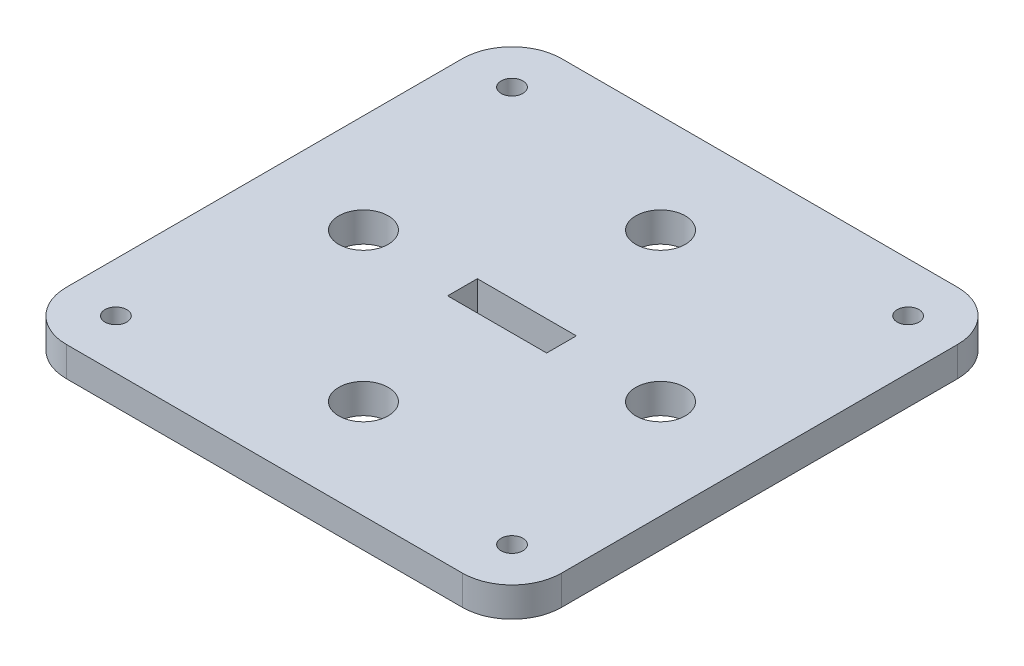
ISO-10303-21;
HEADER;
FILE_DESCRIPTION(('STEP AP214'),'2;1');
FILE_NAME('part.step','',(''),(''),'','','');
FILE_SCHEMA(('AUTOMOTIVE_DESIGN { 1 0 10303 214 1 1 1 1 }'));
ENDSEC;
DATA;
#1=APPLICATION_CONTEXT('core data for automotive mechanical design processes');
#2=APPLICATION_PROTOCOL_DEFINITION('international standard','automotive_design',2000,#1);
#3=PRODUCT_CONTEXT('',#1,'mechanical');
#4=PRODUCT('Part','Part','',(#3));
#5=PRODUCT_RELATED_PRODUCT_CATEGORY('part','',(#4));
#6=PRODUCT_DEFINITION_FORMATION('','',#4);
#7=PRODUCT_DEFINITION_CONTEXT('part definition',#1,'design');
#8=PRODUCT_DEFINITION('design','',#6,#7);
#9=PRODUCT_DEFINITION_SHAPE('','',#8);
#10=(LENGTH_UNIT() NAMED_UNIT(*) SI_UNIT(.MILLI.,.METRE.));
#11=(NAMED_UNIT(*) PLANE_ANGLE_UNIT() SI_UNIT($,.RADIAN.));
#12=(NAMED_UNIT(*) SI_UNIT($,.STERADIAN.) SOLID_ANGLE_UNIT());
#13=UNCERTAINTY_MEASURE_WITH_UNIT(LENGTH_MEASURE(1.E-05),#10,'distance_accuracy_value','');
#14=(GEOMETRIC_REPRESENTATION_CONTEXT(3) GLOBAL_UNCERTAINTY_ASSIGNED_CONTEXT((#13)) GLOBAL_UNIT_ASSIGNED_CONTEXT((#10,
#11,#12)) REPRESENTATION_CONTEXT('',''));
#15=CARTESIAN_POINT('',(0.,0.,0.));
#16=DIRECTION('',(0.,0.,1.));
#17=DIRECTION('',(1.,0.,0.));
#18=AXIS2_PLACEMENT_3D('',#15,#16,#17);
#19=CARTESIAN_POINT('',(0.,3.,0.));
#20=DIRECTION('',(0.,-1.,0.));
#21=DIRECTION('',(0.,0.,-1.));
#22=AXIS2_PLACEMENT_3D('',#19,#20,#21);
#23=PLANE('',#22);
#24=CARTESIAN_POINT('',(15.,3.,0.));
#25=DIRECTION('',(0.,1.,0.));
#26=DIRECTION('',(0.,0.,-1.));
#27=AXIS2_PLACEMENT_3D('',#24,#25,#26);
#28=CIRCLE('',#27,2.5);
#29=CARTESIAN_POINT('',(15.,3.,-2.5));
#30=VERTEX_POINT('',#29);
#31=EDGE_CURVE('E168',#30,#30,#28,.T.);
#32=ORIENTED_EDGE('',*,*,#31,.F.);
#33=EDGE_LOOP('',(#32));
#34=FACE_BOUND('',#33,.T.);
#35=CARTESIAN_POINT('',(-15.,3.,0.));
#36=DIRECTION('',(0.,1.,0.));
#37=DIRECTION('',(0.,0.,1.));
#38=AXIS2_PLACEMENT_3D('',#35,#36,#37);
#39=CIRCLE('',#38,2.5);
#40=CARTESIAN_POINT('',(-15.,3.,2.5));
#41=VERTEX_POINT('',#40);
#42=EDGE_CURVE('E174',#41,#41,#39,.T.);
#43=ORIENTED_EDGE('',*,*,#42,.F.);
#44=EDGE_LOOP('',(#43));
#45=FACE_BOUND('',#44,.T.);
#46=DIRECTION('',(0.,0.,-1.));
#47=VECTOR('',#46,1.);
#48=CARTESIAN_POINT('',(25.,3.,25.));
#49=LINE('',#48,#47);
#50=CARTESIAN_POINT('',(25.,3.,20.));
#51=VERTEX_POINT('',#50);
#52=CARTESIAN_POINT('',(25.,3.,-20.));
#53=VERTEX_POINT('',#52);
#54=EDGE_CURVE('E180',#51,#53,#49,.T.);
#55=ORIENTED_EDGE('',*,*,#54,.T.);
#56=CARTESIAN_POINT('',(20.,3.,-20.));
#57=DIRECTION('',(0.,-1.,0.));
#58=DIRECTION('',(0.,0.,-1.));
#59=AXIS2_PLACEMENT_3D('',#56,#57,#58);
#60=CIRCLE('',#59,5.);
#61=CARTESIAN_POINT('',(20.,3.,-25.));
#62=VERTEX_POINT('',#61);
#63=EDGE_CURVE('E223',#53,#62,#60,.F.);
#64=ORIENTED_EDGE('',*,*,#63,.T.);
#65=DIRECTION('',(-1.,0.,0.));
#66=VECTOR('',#65,1.);
#67=CARTESIAN_POINT('',(-25.,3.,-25.));
#68=LINE('',#67,#66);
#69=CARTESIAN_POINT('',(-20.,3.,-25.));
#70=VERTEX_POINT('',#69);
#71=EDGE_CURVE('E183',#62,#70,#68,.T.);
#72=ORIENTED_EDGE('',*,*,#71,.T.);
#73=CARTESIAN_POINT('',(-20.,3.,-20.));
#74=DIRECTION('',(0.,-1.,0.));
#75=DIRECTION('',(0.,0.,-1.));
#76=AXIS2_PLACEMENT_3D('',#73,#74,#75);
#77=CIRCLE('',#76,5.);
#78=CARTESIAN_POINT('',(-25.,3.,-20.));
#79=VERTEX_POINT('',#78);
#80=EDGE_CURVE('E221',#70,#79,#77,.F.);
#81=ORIENTED_EDGE('',*,*,#80,.T.);
#82=DIRECTION('',(0.,0.,1.));
#83=VECTOR('',#82,1.);
#84=CARTESIAN_POINT('',(-25.,3.,25.));
#85=LINE('',#84,#83);
#86=CARTESIAN_POINT('',(-25.,3.,20.));
#87=VERTEX_POINT('',#86);
#88=EDGE_CURVE('E187',#79,#87,#85,.T.);
#89=ORIENTED_EDGE('',*,*,#88,.T.);
#90=CARTESIAN_POINT('',(-20.,3.,20.));
#91=DIRECTION('',(0.,-1.,0.));
#92=DIRECTION('',(0.,0.,-1.));
#93=AXIS2_PLACEMENT_3D('',#90,#91,#92);
#94=CIRCLE('',#93,5.);
#95=CARTESIAN_POINT('',(-20.,3.,25.));
#96=VERTEX_POINT('',#95);
#97=EDGE_CURVE('E54',#87,#96,#94,.F.);
#98=ORIENTED_EDGE('',*,*,#97,.T.);
#99=DIRECTION('',(1.,0.,0.));
#100=VECTOR('',#99,1.);
#101=CARTESIAN_POINT('',(-25.,3.,25.));
#102=LINE('',#101,#100);
#103=CARTESIAN_POINT('',(20.,3.,25.));
#104=VERTEX_POINT('',#103);
#105=EDGE_CURVE('E189',#96,#104,#102,.T.);
#106=ORIENTED_EDGE('',*,*,#105,.T.);
#107=CARTESIAN_POINT('',(20.,3.,20.));
#108=DIRECTION('',(0.,-1.,0.));
#109=DIRECTION('',(0.,0.,-1.));
#110=AXIS2_PLACEMENT_3D('',#107,#108,#109);
#111=CIRCLE('',#110,5.);
#112=EDGE_CURVE('E218',#104,#51,#111,.F.);
#113=ORIENTED_EDGE('',*,*,#112,.T.);
#114=EDGE_LOOP('',(#55,#64,#72,#81,#89,#98,#106,#113));
#115=FACE_BOUND('',#114,.T.);
#116=DIRECTION('',(0.,0.,-1.));
#117=VECTOR('',#116,1.);
#118=CARTESIAN_POINT('',(5.00000000000001,3.,1.49999999999999));
#119=LINE('',#118,#117);
#120=CARTESIAN_POINT('',(5.00000000000001,3.,1.49999999999999));
#121=VERTEX_POINT('',#120);
#122=CARTESIAN_POINT('',(5.00000000000001,3.,-1.50000000000001));
#123=VERTEX_POINT('',#122);
#124=EDGE_CURVE('E124',#121,#123,#119,.T.);
#125=ORIENTED_EDGE('',*,*,#124,.F.);
#126=DIRECTION('',(1.,0.,0.));
#127=VECTOR('',#126,1.);
#128=CARTESIAN_POINT('',(-4.99999999999999,3.,1.49999999999999));
#129=LINE('',#128,#127);
#130=CARTESIAN_POINT('',(-4.99999999999999,3.,1.49999999999999));
#131=VERTEX_POINT('',#130);
#132=EDGE_CURVE('E150',#131,#121,#129,.T.);
#133=ORIENTED_EDGE('',*,*,#132,.F.);
#134=DIRECTION('',(0.,0.,1.));
#135=VECTOR('',#134,1.);
#136=CARTESIAN_POINT('',(-4.99999999999999,3.,1.49999999999999));
#137=LINE('',#136,#135);
#138=CARTESIAN_POINT('',(-4.99999999999999,3.,-1.50000000000001));
#139=VERTEX_POINT('',#138);
#140=EDGE_CURVE('E148',#139,#131,#137,.T.);
#141=ORIENTED_EDGE('',*,*,#140,.F.);
#142=DIRECTION('',(-1.,0.,0.));
#143=VECTOR('',#142,1.);
#144=CARTESIAN_POINT('',(-4.99999999999999,3.,-1.50000000000001));
#145=LINE('',#144,#143);
#146=EDGE_CURVE('E134',#123,#139,#145,.T.);
#147=ORIENTED_EDGE('',*,*,#146,.F.);
#148=EDGE_LOOP('',(#125,#133,#141,#147));
#149=FACE_BOUND('',#148,.T.);
#150=CARTESIAN_POINT('',(-20.,3.,-20.));
#151=DIRECTION('',(0.,1.,0.));
#152=DIRECTION('',(0.,0.,1.));
#153=AXIS2_PLACEMENT_3D('',#150,#151,#152);
#154=CIRCLE('',#153,1.1);
#155=CARTESIAN_POINT('',(-20.,3.,-18.9));
#156=VERTEX_POINT('',#155);
#157=EDGE_CURVE('E157',#156,#156,#154,.T.);
#158=ORIENTED_EDGE('',*,*,#157,.F.);
#159=EDGE_LOOP('',(#158));
#160=FACE_BOUND('',#159,.T.);
#161=CARTESIAN_POINT('',(20.,3.,-20.));
#162=DIRECTION('',(0.,1.,0.));
#163=DIRECTION('',(0.,0.,-1.));
#164=AXIS2_PLACEMENT_3D('',#161,#162,#163);
#165=CIRCLE('',#164,1.1);
#166=CARTESIAN_POINT('',(20.,3.,-21.1));
#167=VERTEX_POINT('',#166);
#168=EDGE_CURVE('E491',#167,#167,#165,.T.);
#169=ORIENTED_EDGE('',*,*,#168,.F.);
#170=EDGE_LOOP('',(#169));
#171=FACE_BOUND('',#170,.T.);
#172=CARTESIAN_POINT('',(20.,3.,20.));
#173=DIRECTION('',(0.,1.,0.));
#174=DIRECTION('',(0.,0.,1.));
#175=AXIS2_PLACEMENT_3D('',#172,#173,#174);
#176=CIRCLE('',#175,1.1);
#177=CARTESIAN_POINT('',(20.,3.,21.1));
#178=VERTEX_POINT('',#177);
#179=EDGE_CURVE('E485',#178,#178,#176,.T.);
#180=ORIENTED_EDGE('',*,*,#179,.F.);
#181=EDGE_LOOP('',(#180));
#182=FACE_BOUND('',#181,.T.);
#183=CARTESIAN_POINT('',(-20.,3.,20.));
#184=DIRECTION('',(0.,1.,0.));
#185=DIRECTION('',(0.,0.,-1.));
#186=AXIS2_PLACEMENT_3D('',#183,#184,#185);
#187=CIRCLE('',#186,1.1);
#188=CARTESIAN_POINT('',(-20.,3.,18.9));
#189=VERTEX_POINT('',#188);
#190=EDGE_CURVE('E479',#189,#189,#187,.T.);
#191=ORIENTED_EDGE('',*,*,#190,.F.);
#192=EDGE_LOOP('',(#191));
#193=FACE_BOUND('',#192,.T.);
#194=CARTESIAN_POINT('',(0.,3.,-15.));
#195=DIRECTION('',(0.,1.,0.));
#196=DIRECTION('',(0.,0.,1.));
#197=AXIS2_PLACEMENT_3D('',#194,#195,#196);
#198=CIRCLE('',#197,2.5);
#199=CARTESIAN_POINT('',(0.,3.,-12.5));
#200=VERTEX_POINT('',#199);
#201=EDGE_CURVE('E473',#200,#200,#198,.T.);
#202=ORIENTED_EDGE('',*,*,#201,.F.);
#203=EDGE_LOOP('',(#202));
#204=FACE_BOUND('',#203,.T.);
#205=CARTESIAN_POINT('',(0.,3.,15.));
#206=DIRECTION('',(0.,1.,0.));
#207=DIRECTION('',(0.,0.,-1.));
#208=AXIS2_PLACEMENT_3D('',#205,#206,#207);
#209=CIRCLE('',#208,2.5);
#210=CARTESIAN_POINT('',(0.,3.,12.5));
#211=VERTEX_POINT('',#210);
#212=EDGE_CURVE('E464',#211,#211,#209,.T.);
#213=ORIENTED_EDGE('',*,*,#212,.F.);
#214=EDGE_LOOP('',(#213));
#215=FACE_BOUND('',#214,.T.);
#216=ADVANCED_FACE('F33',(#34,#45,#115,#149,#160,#171,#182,#193,#204,#215),#23,.F.);
#217=CARTESIAN_POINT('',(0.,0.,0.));
#218=DIRECTION('',(0.,-1.,0.));
#219=DIRECTION('',(0.,0.,-1.));
#220=AXIS2_PLACEMENT_3D('',#217,#218,#219);
#221=PLANE('',#220);
#222=CARTESIAN_POINT('',(0.,0.,-15.));
#223=DIRECTION('',(0.,1.,0.));
#224=DIRECTION('',(0.,0.,1.));
#225=AXIS2_PLACEMENT_3D('',#222,#223,#224);
#226=CIRCLE('',#225,2.5);
#227=CARTESIAN_POINT('',(0.,0.,-12.5));
#228=VERTEX_POINT('',#227);
#229=EDGE_CURVE('E470',#228,#228,#226,.T.);
#230=ORIENTED_EDGE('',*,*,#229,.T.);
#231=EDGE_LOOP('',(#230));
#232=FACE_BOUND('',#231,.T.);
#233=CARTESIAN_POINT('',(20.,0.,20.));
#234=DIRECTION('',(0.,1.,0.));
#235=DIRECTION('',(0.,0.,1.));
#236=AXIS2_PLACEMENT_3D('',#233,#234,#235);
#237=CIRCLE('',#236,1.1);
#238=CARTESIAN_POINT('',(20.,0.,21.1));
#239=VERTEX_POINT('',#238);
#240=EDGE_CURVE('E482',#239,#239,#237,.T.);
#241=ORIENTED_EDGE('',*,*,#240,.T.);
#242=EDGE_LOOP('',(#241));
#243=FACE_BOUND('',#242,.T.);
#244=CARTESIAN_POINT('',(-20.,0.,-20.));
#245=DIRECTION('',(0.,1.,0.));
#246=DIRECTION('',(0.,0.,1.));
#247=AXIS2_PLACEMENT_3D('',#244,#245,#246);
#248=CIRCLE('',#247,1.1);
#249=CARTESIAN_POINT('',(-20.,0.,-18.9));
#250=VERTEX_POINT('',#249);
#251=EDGE_CURVE('E494',#250,#250,#248,.T.);
#252=ORIENTED_EDGE('',*,*,#251,.T.);
#253=EDGE_LOOP('',(#252));
#254=FACE_BOUND('',#253,.T.);
#255=CARTESIAN_POINT('',(-15.,0.,0.));
#256=DIRECTION('',(0.,1.,0.));
#257=DIRECTION('',(0.,0.,1.));
#258=AXIS2_PLACEMENT_3D('',#255,#256,#257);
#259=CIRCLE('',#258,2.5);
#260=CARTESIAN_POINT('',(-15.,0.,2.5));
#261=VERTEX_POINT('',#260);
#262=EDGE_CURVE('E171',#261,#261,#259,.T.);
#263=ORIENTED_EDGE('',*,*,#262,.T.);
#264=EDGE_LOOP('',(#263));
#265=FACE_BOUND('',#264,.T.);
#266=DIRECTION('',(-1.,0.,0.));
#267=VECTOR('',#266,1.);
#268=CARTESIAN_POINT('',(-25.,0.,-25.));
#269=LINE('',#268,#267);
#270=CARTESIAN_POINT('',(20.,0.,-25.));
#271=VERTEX_POINT('',#270);
#272=CARTESIAN_POINT('',(-20.,0.,-25.));
#273=VERTEX_POINT('',#272);
#274=EDGE_CURVE('E194',#271,#273,#269,.T.);
#275=ORIENTED_EDGE('',*,*,#274,.F.);
#276=CARTESIAN_POINT('',(20.,0.,-20.));
#277=DIRECTION('',(0.,-1.,0.));
#278=DIRECTION('',(0.,0.,-1.));
#279=AXIS2_PLACEMENT_3D('',#276,#277,#278);
#280=CIRCLE('',#279,5.);
#281=CARTESIAN_POINT('',(25.,0.,-20.));
#282=VERTEX_POINT('',#281);
#283=EDGE_CURVE('E211',#271,#282,#280,.T.);
#284=ORIENTED_EDGE('',*,*,#283,.T.);
#285=DIRECTION('',(0.,0.,-1.));
#286=VECTOR('',#285,1.);
#287=CARTESIAN_POINT('',(25.,0.,25.));
#288=LINE('',#287,#286);
#289=CARTESIAN_POINT('',(25.,0.,20.));
#290=VERTEX_POINT('',#289);
#291=EDGE_CURVE('E177',#290,#282,#288,.T.);
#292=ORIENTED_EDGE('',*,*,#291,.F.);
#293=CARTESIAN_POINT('',(20.,0.,20.));
#294=DIRECTION('',(0.,-1.,0.));
#295=DIRECTION('',(0.,0.,-1.));
#296=AXIS2_PLACEMENT_3D('',#293,#294,#295);
#297=CIRCLE('',#296,5.);
#298=CARTESIAN_POINT('',(20.,0.,25.));
#299=VERTEX_POINT('',#298);
#300=EDGE_CURVE('E205',#290,#299,#297,.T.);
#301=ORIENTED_EDGE('',*,*,#300,.T.);
#302=DIRECTION('',(1.,0.,0.));
#303=VECTOR('',#302,1.);
#304=CARTESIAN_POINT('',(-25.,0.,25.));
#305=LINE('',#304,#303);
#306=CARTESIAN_POINT('',(-20.,0.,25.));
#307=VERTEX_POINT('',#306);
#308=EDGE_CURVE('E184',#307,#299,#305,.T.);
#309=ORIENTED_EDGE('',*,*,#308,.F.);
#310=CARTESIAN_POINT('',(-20.,0.,20.));
#311=DIRECTION('',(0.,-1.,0.));
#312=DIRECTION('',(0.,0.,-1.));
#313=AXIS2_PLACEMENT_3D('',#310,#311,#312);
#314=CIRCLE('',#313,5.);
#315=CARTESIAN_POINT('',(-25.,0.,20.));
#316=VERTEX_POINT('',#315);
#317=EDGE_CURVE('E207',#307,#316,#314,.T.);
#318=ORIENTED_EDGE('',*,*,#317,.T.);
#319=DIRECTION('',(0.,0.,1.));
#320=VECTOR('',#319,1.);
#321=CARTESIAN_POINT('',(-25.,0.,25.));
#322=LINE('',#321,#320);
#323=CARTESIAN_POINT('',(-25.,0.,-20.));
#324=VERTEX_POINT('',#323);
#325=EDGE_CURVE('E197',#324,#316,#322,.T.);
#326=ORIENTED_EDGE('',*,*,#325,.F.);
#327=CARTESIAN_POINT('',(-20.,0.,-20.));
#328=DIRECTION('',(0.,-1.,0.));
#329=DIRECTION('',(0.,0.,-1.));
#330=AXIS2_PLACEMENT_3D('',#327,#328,#329);
#331=CIRCLE('',#330,5.);
#332=EDGE_CURVE('E209',#324,#273,#331,.T.);
#333=ORIENTED_EDGE('',*,*,#332,.T.);
#334=EDGE_LOOP('',(#275,#284,#292,#301,#309,#318,#326,#333));
#335=FACE_BOUND('',#334,.T.);
#336=CARTESIAN_POINT('',(15.,0.,0.));
#337=DIRECTION('',(0.,1.,0.));
#338=DIRECTION('',(0.,0.,-1.));
#339=AXIS2_PLACEMENT_3D('',#336,#337,#338);
#340=CIRCLE('',#339,2.5);
#341=CARTESIAN_POINT('',(15.,0.,-2.5));
#342=VERTEX_POINT('',#341);
#343=EDGE_CURVE('E142',#342,#342,#340,.T.);
#344=ORIENTED_EDGE('',*,*,#343,.T.);
#345=EDGE_LOOP('',(#344));
#346=FACE_BOUND('',#345,.T.);
#347=DIRECTION('',(1.,0.,0.));
#348=VECTOR('',#347,1.);
#349=CARTESIAN_POINT('',(-4.99999999999999,0.,1.49999999999999));
#350=LINE('',#349,#348);
#351=CARTESIAN_POINT('',(-4.99999999999999,0.,1.49999999999999));
#352=VERTEX_POINT('',#351);
#353=CARTESIAN_POINT('',(5.00000000000001,0.,1.49999999999999));
#354=VERTEX_POINT('',#353);
#355=EDGE_CURVE('E135',#352,#354,#350,.T.);
#356=ORIENTED_EDGE('',*,*,#355,.T.);
#357=DIRECTION('',(0.,0.,-1.));
#358=VECTOR('',#357,1.);
#359=CARTESIAN_POINT('',(5.00000000000001,0.,1.49999999999999));
#360=LINE('',#359,#358);
#361=CARTESIAN_POINT('',(5.00000000000001,0.,-1.50000000000001));
#362=VERTEX_POINT('',#361);
#363=EDGE_CURVE('E155',#354,#362,#360,.T.);
#364=ORIENTED_EDGE('',*,*,#363,.T.);
#365=DIRECTION('',(-1.,0.,0.));
#366=VECTOR('',#365,1.);
#367=CARTESIAN_POINT('',(-4.99999999999999,0.,-1.50000000000001));
#368=LINE('',#367,#366);
#369=CARTESIAN_POINT('',(-4.99999999999999,0.,-1.50000000000001));
#370=VERTEX_POINT('',#369);
#371=EDGE_CURVE('E141',#362,#370,#368,.T.);
#372=ORIENTED_EDGE('',*,*,#371,.T.);
#373=DIRECTION('',(0.,0.,1.));
#374=VECTOR('',#373,1.);
#375=CARTESIAN_POINT('',(-4.99999999999999,0.,1.49999999999999));
#376=LINE('',#375,#374);
#377=EDGE_CURVE('E159',#370,#352,#376,.T.);
#378=ORIENTED_EDGE('',*,*,#377,.T.);
#379=EDGE_LOOP('',(#356,#364,#372,#378));
#380=FACE_BOUND('',#379,.T.);
#381=CARTESIAN_POINT('',(20.,0.,-20.));
#382=DIRECTION('',(0.,1.,0.));
#383=DIRECTION('',(0.,0.,-1.));
#384=AXIS2_PLACEMENT_3D('',#381,#382,#383);
#385=CIRCLE('',#384,1.1);
#386=CARTESIAN_POINT('',(20.,0.,-21.1));
#387=VERTEX_POINT('',#386);
#388=EDGE_CURVE('E488',#387,#387,#385,.T.);
#389=ORIENTED_EDGE('',*,*,#388,.T.);
#390=EDGE_LOOP('',(#389));
#391=FACE_BOUND('',#390,.T.);
#392=CARTESIAN_POINT('',(-20.,0.,20.));
#393=DIRECTION('',(0.,1.,0.));
#394=DIRECTION('',(0.,0.,-1.));
#395=AXIS2_PLACEMENT_3D('',#392,#393,#394);
#396=CIRCLE('',#395,1.1);
#397=CARTESIAN_POINT('',(-20.,0.,18.9));
#398=VERTEX_POINT('',#397);
#399=EDGE_CURVE('E476',#398,#398,#396,.T.);
#400=ORIENTED_EDGE('',*,*,#399,.T.);
#401=EDGE_LOOP('',(#400));
#402=FACE_BOUND('',#401,.T.);
#403=CARTESIAN_POINT('',(0.,0.,15.));
#404=DIRECTION('',(0.,1.,0.));
#405=DIRECTION('',(0.,0.,-1.));
#406=AXIS2_PLACEMENT_3D('',#403,#404,#405);
#407=CIRCLE('',#406,2.5);
#408=CARTESIAN_POINT('',(0.,0.,12.5));
#409=VERTEX_POINT('',#408);
#410=EDGE_CURVE('E467',#409,#409,#407,.T.);
#411=ORIENTED_EDGE('',*,*,#410,.T.);
#412=EDGE_LOOP('',(#411));
#413=FACE_BOUND('',#412,.T.);
#414=ADVANCED_FACE('F239',(#232,#243,#254,#265,#335,#346,#380,#391,#402,#413),#221,.T.);
#415=CARTESIAN_POINT('',(25.,3.,25.));
#416=DIRECTION('',(-1.,0.,0.));
#417=DIRECTION('',(0.,0.,1.));
#418=AXIS2_PLACEMENT_3D('',#415,#416,#417);
#419=PLANE('',#418);
#420=ORIENTED_EDGE('',*,*,#291,.T.);
#421=DIRECTION('',(0.,-1.,0.));
#422=VECTOR('',#421,1.);
#423=CARTESIAN_POINT('',(25.,3.,-20.));
#424=LINE('',#423,#422);
#425=EDGE_CURVE('E216',#282,#53,#424,.F.);
#426=ORIENTED_EDGE('',*,*,#425,.T.);
#427=ORIENTED_EDGE('',*,*,#54,.F.);
#428=DIRECTION('',(0.,-1.,0.));
#429=VECTOR('',#428,1.);
#430=CARTESIAN_POINT('',(25.,3.,20.));
#431=LINE('',#430,#429);
#432=EDGE_CURVE('E213',#51,#290,#431,.T.);
#433=ORIENTED_EDGE('',*,*,#432,.T.);
#434=EDGE_LOOP('',(#420,#426,#427,#433));
#435=FACE_BOUND('',#434,.T.);
#436=ADVANCED_FACE('F252',(#435),#419,.F.);
#437=CARTESIAN_POINT('',(-25.,3.,-25.));
#438=DIRECTION('',(0.,0.,1.));
#439=DIRECTION('',(1.,0.,0.));
#440=AXIS2_PLACEMENT_3D('',#437,#438,#439);
#441=PLANE('',#440);
#442=ORIENTED_EDGE('',*,*,#71,.F.);
#443=DIRECTION('',(0.,-1.,0.));
#444=VECTOR('',#443,1.);
#445=CARTESIAN_POINT('',(20.,3.,-25.));
#446=LINE('',#445,#444);
#447=EDGE_CURVE('E202',#62,#271,#446,.T.);
#448=ORIENTED_EDGE('',*,*,#447,.T.);
#449=ORIENTED_EDGE('',*,*,#274,.T.);
#450=DIRECTION('',(0.,-1.,0.));
#451=VECTOR('',#450,1.);
#452=CARTESIAN_POINT('',(-20.,3.,-25.));
#453=LINE('',#452,#451);
#454=EDGE_CURVE('E191',#273,#70,#453,.F.);
#455=ORIENTED_EDGE('',*,*,#454,.T.);
#456=EDGE_LOOP('',(#442,#448,#449,#455));
#457=FACE_BOUND('',#456,.T.);
#458=ADVANCED_FACE('F260',(#457),#441,.F.);
#459=CARTESIAN_POINT('',(-25.,3.,25.));
#460=DIRECTION('',(1.,0.,0.));
#461=DIRECTION('',(0.,0.,-1.));
#462=AXIS2_PLACEMENT_3D('',#459,#460,#461);
#463=PLANE('',#462);
#464=ORIENTED_EDGE('',*,*,#88,.F.);
#465=DIRECTION('',(0.,-1.,0.));
#466=VECTOR('',#465,1.);
#467=CARTESIAN_POINT('',(-25.,3.,-20.));
#468=LINE('',#467,#466);
#469=EDGE_CURVE('E227',#79,#324,#468,.T.);
#470=ORIENTED_EDGE('',*,*,#469,.T.);
#471=ORIENTED_EDGE('',*,*,#325,.T.);
#472=DIRECTION('',(0.,-1.,0.));
#473=VECTOR('',#472,1.);
#474=CARTESIAN_POINT('',(-25.,3.,20.));
#475=LINE('',#474,#473);
#476=EDGE_CURVE('E225',#316,#87,#475,.F.);
#477=ORIENTED_EDGE('',*,*,#476,.T.);
#478=EDGE_LOOP('',(#464,#470,#471,#477));
#479=FACE_BOUND('',#478,.T.);
#480=ADVANCED_FACE('F233',(#479),#463,.F.);
#481=CARTESIAN_POINT('',(-25.,3.,25.));
#482=DIRECTION('',(0.,0.,-1.));
#483=DIRECTION('',(-1.,0.,0.));
#484=AXIS2_PLACEMENT_3D('',#481,#482,#483);
#485=PLANE('',#484);
#486=ORIENTED_EDGE('',*,*,#105,.F.);
#487=DIRECTION('',(0.,-1.,0.));
#488=VECTOR('',#487,1.);
#489=CARTESIAN_POINT('',(-20.,3.,25.));
#490=LINE('',#489,#488);
#491=EDGE_CURVE('E11',#96,#307,#490,.T.);
#492=ORIENTED_EDGE('',*,*,#491,.T.);
#493=ORIENTED_EDGE('',*,*,#308,.T.);
#494=DIRECTION('',(0.,-1.,0.));
#495=VECTOR('',#494,1.);
#496=CARTESIAN_POINT('',(20.,3.,25.));
#497=LINE('',#496,#495);
#498=EDGE_CURVE('E41',#299,#104,#497,.F.);
#499=ORIENTED_EDGE('',*,*,#498,.T.);
#500=EDGE_LOOP('',(#486,#492,#493,#499));
#501=FACE_BOUND('',#500,.T.);
#502=ADVANCED_FACE('F245',(#501),#485,.F.);
#503=CARTESIAN_POINT('',(-15.,3.,0.));
#504=DIRECTION('',(0.,-1.,0.));
#505=DIRECTION('',(0.,0.,-1.));
#506=AXIS2_PLACEMENT_3D('',#503,#504,#505);
#507=CYLINDRICAL_SURFACE('',#506,2.5);
#508=ORIENTED_EDGE('',*,*,#42,.T.);
#509=EDGE_LOOP('',(#508));
#510=FACE_BOUND('',#509,.T.);
#511=ORIENTED_EDGE('',*,*,#262,.F.);
#512=EDGE_LOOP('',(#511));
#513=FACE_BOUND('',#512,.T.);
#514=ADVANCED_FACE('F282',(#510,#513),#507,.F.);
#515=CARTESIAN_POINT('',(15.,3.,0.));
#516=DIRECTION('',(0.,-1.,0.));
#517=DIRECTION('',(0.,0.,-1.));
#518=AXIS2_PLACEMENT_3D('',#515,#516,#517);
#519=CYLINDRICAL_SURFACE('',#518,2.5);
#520=ORIENTED_EDGE('',*,*,#31,.T.);
#521=EDGE_LOOP('',(#520));
#522=FACE_BOUND('',#521,.T.);
#523=ORIENTED_EDGE('',*,*,#343,.F.);
#524=EDGE_LOOP('',(#523));
#525=FACE_BOUND('',#524,.T.);
#526=ADVANCED_FACE('F315',(#522,#525),#519,.F.);
#527=CARTESIAN_POINT('',(5.00000000000001,3.,1.49999999999999));
#528=DIRECTION('',(-1.,0.,0.));
#529=DIRECTION('',(0.,0.,1.));
#530=AXIS2_PLACEMENT_3D('',#527,#528,#529);
#531=PLANE('',#530);
#532=ORIENTED_EDGE('',*,*,#363,.F.);
#533=DIRECTION('',(0.,-1.,0.));
#534=VECTOR('',#533,1.);
#535=CARTESIAN_POINT('',(5.00000000000001,3.,1.49999999999999));
#536=LINE('',#535,#534);
#537=EDGE_CURVE('E130',#121,#354,#536,.T.);
#538=ORIENTED_EDGE('',*,*,#537,.F.);
#539=ORIENTED_EDGE('',*,*,#124,.T.);
#540=DIRECTION('',(0.,-1.,0.));
#541=VECTOR('',#540,1.);
#542=CARTESIAN_POINT('',(5.00000000000001,3.,-1.50000000000001));
#543=LINE('',#542,#541);
#544=EDGE_CURVE('E127',#123,#362,#543,.T.);
#545=ORIENTED_EDGE('',*,*,#544,.T.);
#546=EDGE_LOOP('',(#532,#538,#539,#545));
#547=FACE_BOUND('',#546,.T.);
#548=ADVANCED_FACE('F126',(#547),#531,.T.);
#549=CARTESIAN_POINT('',(-4.99999999999999,3.,-1.50000000000001));
#550=DIRECTION('',(0.,0.,1.));
#551=DIRECTION('',(1.,0.,0.));
#552=AXIS2_PLACEMENT_3D('',#549,#550,#551);
#553=PLANE('',#552);
#554=ORIENTED_EDGE('',*,*,#371,.F.);
#555=ORIENTED_EDGE('',*,*,#544,.F.);
#556=ORIENTED_EDGE('',*,*,#146,.T.);
#557=DIRECTION('',(0.,-1.,0.));
#558=VECTOR('',#557,1.);
#559=CARTESIAN_POINT('',(-4.99999999999999,3.,-1.50000000000001));
#560=LINE('',#559,#558);
#561=EDGE_CURVE('E143',#139,#370,#560,.T.);
#562=ORIENTED_EDGE('',*,*,#561,.T.);
#563=EDGE_LOOP('',(#554,#555,#556,#562));
#564=FACE_BOUND('',#563,.T.);
#565=ADVANCED_FACE('F138',(#564),#553,.T.);
#566=CARTESIAN_POINT('',(-4.99999999999999,3.,1.49999999999999));
#567=DIRECTION('',(1.,0.,0.));
#568=DIRECTION('',(0.,0.,-1.));
#569=AXIS2_PLACEMENT_3D('',#566,#567,#568);
#570=PLANE('',#569);
#571=ORIENTED_EDGE('',*,*,#377,.F.);
#572=ORIENTED_EDGE('',*,*,#561,.F.);
#573=ORIENTED_EDGE('',*,*,#140,.T.);
#574=DIRECTION('',(0.,-1.,0.));
#575=VECTOR('',#574,1.);
#576=CARTESIAN_POINT('',(-4.99999999999999,3.,1.49999999999999));
#577=LINE('',#576,#575);
#578=EDGE_CURVE('E165',#131,#352,#577,.T.);
#579=ORIENTED_EDGE('',*,*,#578,.T.);
#580=EDGE_LOOP('',(#571,#572,#573,#579));
#581=FACE_BOUND('',#580,.T.);
#582=ADVANCED_FACE('F334',(#581),#570,.T.);
#583=CARTESIAN_POINT('',(-4.99999999999999,3.,1.49999999999999));
#584=DIRECTION('',(0.,0.,-1.));
#585=DIRECTION('',(-1.,0.,0.));
#586=AXIS2_PLACEMENT_3D('',#583,#584,#585);
#587=PLANE('',#586);
#588=ORIENTED_EDGE('',*,*,#355,.F.);
#589=ORIENTED_EDGE('',*,*,#578,.F.);
#590=ORIENTED_EDGE('',*,*,#132,.T.);
#591=ORIENTED_EDGE('',*,*,#537,.T.);
#592=EDGE_LOOP('',(#588,#589,#590,#591));
#593=FACE_BOUND('',#592,.T.);
#594=ADVANCED_FACE('F341',(#593),#587,.T.);
#595=CARTESIAN_POINT('',(-20.,3.,-20.));
#596=DIRECTION('',(0.,-1.,0.));
#597=DIRECTION('',(0.,0.,-1.));
#598=AXIS2_PLACEMENT_3D('',#595,#596,#597);
#599=CYLINDRICAL_SURFACE('',#598,1.1);
#600=ORIENTED_EDGE('',*,*,#157,.T.);
#601=EDGE_LOOP('',(#600));
#602=FACE_BOUND('',#601,.T.);
#603=ORIENTED_EDGE('',*,*,#251,.F.);
#604=EDGE_LOOP('',(#603));
#605=FACE_BOUND('',#604,.T.);
#606=ADVANCED_FACE('F349',(#602,#605),#599,.F.);
#607=CARTESIAN_POINT('',(20.,3.,-20.));
#608=DIRECTION('',(0.,-1.,0.));
#609=DIRECTION('',(0.,0.,-1.));
#610=AXIS2_PLACEMENT_3D('',#607,#608,#609);
#611=CYLINDRICAL_SURFACE('',#610,1.1);
#612=ORIENTED_EDGE('',*,*,#168,.T.);
#613=EDGE_LOOP('',(#612));
#614=FACE_BOUND('',#613,.T.);
#615=ORIENTED_EDGE('',*,*,#388,.F.);
#616=EDGE_LOOP('',(#615));
#617=FACE_BOUND('',#616,.T.);
#618=ADVANCED_FACE('F357',(#614,#617),#611,.F.);
#619=CARTESIAN_POINT('',(20.,3.,20.));
#620=DIRECTION('',(0.,-1.,0.));
#621=DIRECTION('',(0.,0.,-1.));
#622=AXIS2_PLACEMENT_3D('',#619,#620,#621);
#623=CYLINDRICAL_SURFACE('',#622,1.1);
#624=ORIENTED_EDGE('',*,*,#179,.T.);
#625=EDGE_LOOP('',(#624));
#626=FACE_BOUND('',#625,.T.);
#627=ORIENTED_EDGE('',*,*,#240,.F.);
#628=EDGE_LOOP('',(#627));
#629=FACE_BOUND('',#628,.T.);
#630=ADVANCED_FACE('F365',(#626,#629),#623,.F.);
#631=CARTESIAN_POINT('',(-20.,3.,20.));
#632=DIRECTION('',(0.,-1.,0.));
#633=DIRECTION('',(0.,0.,-1.));
#634=AXIS2_PLACEMENT_3D('',#631,#632,#633);
#635=CYLINDRICAL_SURFACE('',#634,1.1);
#636=ORIENTED_EDGE('',*,*,#190,.T.);
#637=EDGE_LOOP('',(#636));
#638=FACE_BOUND('',#637,.T.);
#639=ORIENTED_EDGE('',*,*,#399,.F.);
#640=EDGE_LOOP('',(#639));
#641=FACE_BOUND('',#640,.T.);
#642=ADVANCED_FACE('F373',(#638,#641),#635,.F.);
#643=CARTESIAN_POINT('',(0.,3.,-15.));
#644=DIRECTION('',(0.,-1.,0.));
#645=DIRECTION('',(0.,0.,-1.));
#646=AXIS2_PLACEMENT_3D('',#643,#644,#645);
#647=CYLINDRICAL_SURFACE('',#646,2.5);
#648=ORIENTED_EDGE('',*,*,#201,.T.);
#649=EDGE_LOOP('',(#648));
#650=FACE_BOUND('',#649,.T.);
#651=ORIENTED_EDGE('',*,*,#229,.F.);
#652=EDGE_LOOP('',(#651));
#653=FACE_BOUND('',#652,.T.);
#654=ADVANCED_FACE('F381',(#650,#653),#647,.F.);
#655=CARTESIAN_POINT('',(0.,3.,15.));
#656=DIRECTION('',(0.,-1.,0.));
#657=DIRECTION('',(0.,0.,-1.));
#658=AXIS2_PLACEMENT_3D('',#655,#656,#657);
#659=CYLINDRICAL_SURFACE('',#658,2.5);
#660=ORIENTED_EDGE('',*,*,#212,.T.);
#661=EDGE_LOOP('',(#660));
#662=FACE_BOUND('',#661,.T.);
#663=ORIENTED_EDGE('',*,*,#410,.F.);
#664=EDGE_LOOP('',(#663));
#665=FACE_BOUND('',#664,.T.);
#666=ADVANCED_FACE('F269',(#662,#665),#659,.F.);
#667=CARTESIAN_POINT('',(20.,3.,-20.));
#668=DIRECTION('',(0.,-1.,0.));
#669=DIRECTION('',(0.,0.,-1.));
#670=AXIS2_PLACEMENT_3D('',#667,#668,#669);
#671=CYLINDRICAL_SURFACE('',#670,5.);
#672=ORIENTED_EDGE('',*,*,#63,.F.);
#673=ORIENTED_EDGE('',*,*,#425,.F.);
#674=ORIENTED_EDGE('',*,*,#283,.F.);
#675=ORIENTED_EDGE('',*,*,#447,.F.);
#676=EDGE_LOOP('',(#672,#673,#674,#675));
#677=FACE_BOUND('',#676,.T.);
#678=ADVANCED_FACE('F257',(#677),#671,.T.);
#679=CARTESIAN_POINT('',(-20.,3.,-20.));
#680=DIRECTION('',(0.,-1.,0.));
#681=DIRECTION('',(0.,0.,-1.));
#682=AXIS2_PLACEMENT_3D('',#679,#680,#681);
#683=CYLINDRICAL_SURFACE('',#682,5.);
#684=ORIENTED_EDGE('',*,*,#80,.F.);
#685=ORIENTED_EDGE('',*,*,#454,.F.);
#686=ORIENTED_EDGE('',*,*,#332,.F.);
#687=ORIENTED_EDGE('',*,*,#469,.F.);
#688=EDGE_LOOP('',(#684,#685,#686,#687));
#689=FACE_BOUND('',#688,.T.);
#690=ADVANCED_FACE('F262',(#689),#683,.T.);
#691=CARTESIAN_POINT('',(-20.,3.,20.));
#692=DIRECTION('',(0.,-1.,0.));
#693=DIRECTION('',(0.,0.,-1.));
#694=AXIS2_PLACEMENT_3D('',#691,#692,#693);
#695=CYLINDRICAL_SURFACE('',#694,5.);
#696=ORIENTED_EDGE('',*,*,#97,.F.);
#697=ORIENTED_EDGE('',*,*,#476,.F.);
#698=ORIENTED_EDGE('',*,*,#317,.F.);
#699=ORIENTED_EDGE('',*,*,#491,.F.);
#700=EDGE_LOOP('',(#696,#697,#698,#699));
#701=FACE_BOUND('',#700,.T.);
#702=ADVANCED_FACE('F244',(#701),#695,.T.);
#703=CARTESIAN_POINT('',(20.,3.,20.));
#704=DIRECTION('',(0.,-1.,0.));
#705=DIRECTION('',(0.,0.,-1.));
#706=AXIS2_PLACEMENT_3D('',#703,#704,#705);
#707=CYLINDRICAL_SURFACE('',#706,5.);
#708=ORIENTED_EDGE('',*,*,#112,.F.);
#709=ORIENTED_EDGE('',*,*,#498,.F.);
#710=ORIENTED_EDGE('',*,*,#300,.F.);
#711=ORIENTED_EDGE('',*,*,#432,.F.);
#712=EDGE_LOOP('',(#708,#709,#710,#711));
#713=FACE_BOUND('',#712,.T.);
#714=ADVANCED_FACE('F35',(#713),#707,.T.);
#715=CLOSED_SHELL('',(#216,#414,#436,#458,#480,#502,#514,#526,#548,#565,#582,#594,#606,#618,
#630,#642,#654,#666,#678,#690,#702,#714));
#716=MANIFOLD_SOLID_BREP('B2',#715);
#717=ADVANCED_BREP_SHAPE_REPRESENTATION('',(#18,#716),#14);
#718=SHAPE_DEFINITION_REPRESENTATION(#9,#717);
ENDSEC;
END-ISO-10303-21;
